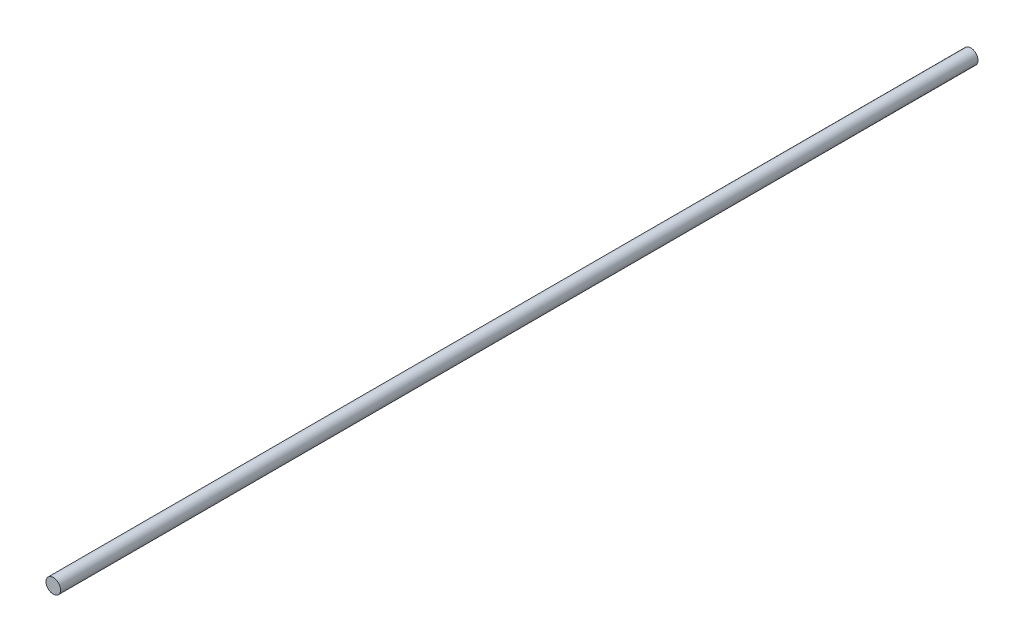
ISO-10303-21;
HEADER;
FILE_DESCRIPTION(('STEP AP214'),'2;1');
FILE_NAME('part.step','',(''),(''),'','','');
FILE_SCHEMA(('AUTOMOTIVE_DESIGN { 1 0 10303 214 1 1 1 1 }'));
ENDSEC;
DATA;
#1=APPLICATION_CONTEXT('core data for automotive mechanical design processes');
#2=APPLICATION_PROTOCOL_DEFINITION('international standard','automotive_design',2000,#1);
#3=PRODUCT_CONTEXT('',#1,'mechanical');
#4=PRODUCT('Part','Part','',(#3));
#5=PRODUCT_RELATED_PRODUCT_CATEGORY('part','',(#4));
#6=PRODUCT_DEFINITION_FORMATION('','',#4);
#7=PRODUCT_DEFINITION_CONTEXT('part definition',#1,'design');
#8=PRODUCT_DEFINITION('design','',#6,#7);
#9=PRODUCT_DEFINITION_SHAPE('','',#8);
#10=(LENGTH_UNIT() NAMED_UNIT(*) SI_UNIT(.MILLI.,.METRE.));
#11=(NAMED_UNIT(*) PLANE_ANGLE_UNIT() SI_UNIT($,.RADIAN.));
#12=(NAMED_UNIT(*) SI_UNIT($,.STERADIAN.) SOLID_ANGLE_UNIT());
#13=UNCERTAINTY_MEASURE_WITH_UNIT(LENGTH_MEASURE(1.E-05),#10,'distance_accuracy_value','');
#14=(GEOMETRIC_REPRESENTATION_CONTEXT(3) GLOBAL_UNCERTAINTY_ASSIGNED_CONTEXT((#13)) GLOBAL_UNIT_ASSIGNED_CONTEXT((#10,
#11,#12)) REPRESENTATION_CONTEXT('',''));
#15=CARTESIAN_POINT('',(0.,0.,0.));
#16=DIRECTION('',(0.,0.,1.));
#17=DIRECTION('',(1.,0.,0.));
#18=AXIS2_PLACEMENT_3D('',#15,#16,#17);
#19=CARTESIAN_POINT('',(0.,0.,400.));
#20=DIRECTION('',(0.,0.,-1.));
#21=DIRECTION('',(-1.,0.,0.));
#22=AXIS2_PLACEMENT_3D('',#19,#20,#21);
#23=CYLINDRICAL_SURFACE('',#22,3.175);
#24=CARTESIAN_POINT('',(0.,0.,400.));
#25=DIRECTION('',(0.,0.,1.));
#26=DIRECTION('',(1.,0.,0.));
#27=AXIS2_PLACEMENT_3D('',#24,#25,#26);
#28=CIRCLE('',#27,3.175);
#29=CARTESIAN_POINT('',(3.175,0.,400.));
#30=VERTEX_POINT('',#29);
#31=EDGE_CURVE('E10',#30,#30,#28,.T.);
#32=ORIENTED_EDGE('',*,*,#31,.F.);
#33=EDGE_LOOP('',(#32));
#34=FACE_BOUND('',#33,.T.);
#35=CARTESIAN_POINT('',(0.,0.,0.));
#36=DIRECTION('',(0.,0.,1.));
#37=DIRECTION('',(1.,0.,0.));
#38=AXIS2_PLACEMENT_3D('',#35,#36,#37);
#39=CIRCLE('',#38,3.175);
#40=CARTESIAN_POINT('',(3.175,0.,0.));
#41=VERTEX_POINT('',#40);
#42=EDGE_CURVE('E40',#41,#41,#39,.T.);
#43=ORIENTED_EDGE('',*,*,#42,.T.);
#44=EDGE_LOOP('',(#43));
#45=FACE_BOUND('',#44,.T.);
#46=ADVANCED_FACE('F37',(#34,#45),#23,.T.);
#47=CARTESIAN_POINT('',(0.,0.,400.));
#48=DIRECTION('',(0.,0.,1.));
#49=DIRECTION('',(1.,0.,0.));
#50=AXIS2_PLACEMENT_3D('',#47,#48,#49);
#51=PLANE('',#50);
#52=ORIENTED_EDGE('',*,*,#31,.T.);
#53=EDGE_LOOP('',(#52));
#54=FACE_BOUND('',#53,.T.);
#55=ADVANCED_FACE('F54',(#54),#51,.T.);
#56=CARTESIAN_POINT('',(0.,0.,0.));
#57=DIRECTION('',(0.,0.,1.));
#58=DIRECTION('',(1.,0.,0.));
#59=AXIS2_PLACEMENT_3D('',#56,#57,#58);
#60=PLANE('',#59);
#61=ORIENTED_EDGE('',*,*,#42,.F.);
#62=EDGE_LOOP('',(#61));
#63=FACE_BOUND('',#62,.T.);
#64=ADVANCED_FACE('F52',(#63),#60,.F.);
#65=CLOSED_SHELL('',(#46,#55,#64));
#66=MANIFOLD_SOLID_BREP('B2',#65);
#67=ADVANCED_BREP_SHAPE_REPRESENTATION('',(#18,#66),#14);
#68=SHAPE_DEFINITION_REPRESENTATION(#9,#67);
ENDSEC;
END-ISO-10303-21;
